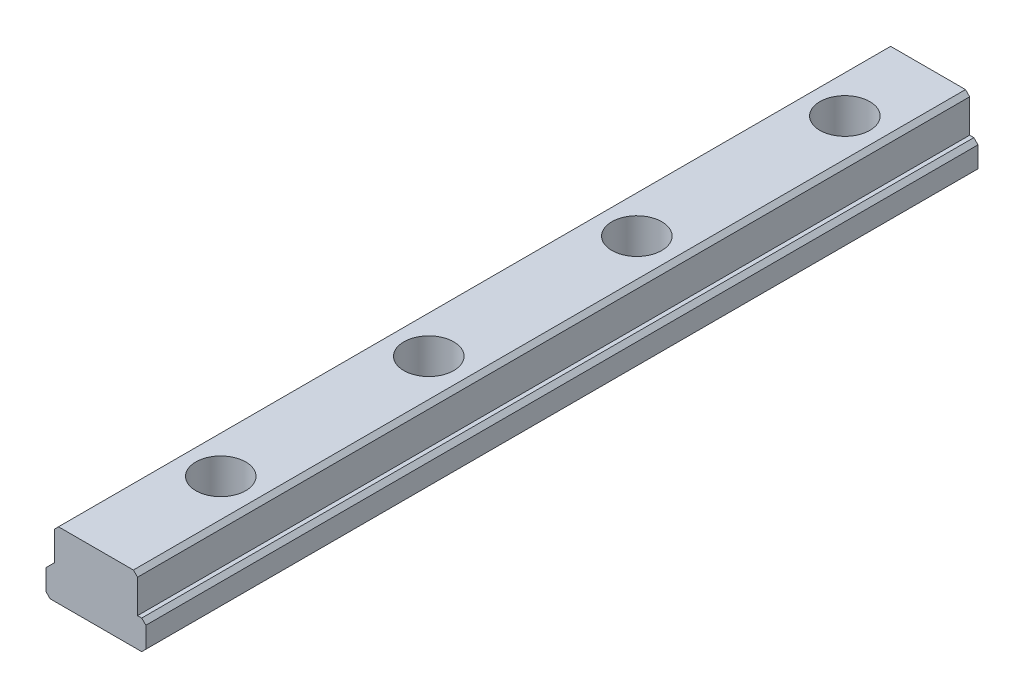
ISO-10303-21;
HEADER;
FILE_DESCRIPTION(('STEP AP214'),'2;1');
FILE_NAME('part.step','',(''),(''),'','','');
FILE_SCHEMA(('AUTOMOTIVE_DESIGN { 1 0 10303 214 1 1 1 1 }'));
ENDSEC;
DATA;
#1=APPLICATION_CONTEXT('core data for automotive mechanical design processes');
#2=APPLICATION_PROTOCOL_DEFINITION('international standard','automotive_design',2000,#1);
#3=PRODUCT_CONTEXT('',#1,'mechanical');
#4=PRODUCT('Part','Part','',(#3));
#5=PRODUCT_RELATED_PRODUCT_CATEGORY('part','',(#4));
#6=PRODUCT_DEFINITION_FORMATION('','',#4);
#7=PRODUCT_DEFINITION_CONTEXT('part definition',#1,'design');
#8=PRODUCT_DEFINITION('design','',#6,#7);
#9=PRODUCT_DEFINITION_SHAPE('','',#8);
#10=(LENGTH_UNIT() NAMED_UNIT(*) SI_UNIT(.MILLI.,.METRE.));
#11=(NAMED_UNIT(*) PLANE_ANGLE_UNIT() SI_UNIT($,.RADIAN.));
#12=(NAMED_UNIT(*) SI_UNIT($,.STERADIAN.) SOLID_ANGLE_UNIT());
#13=UNCERTAINTY_MEASURE_WITH_UNIT(LENGTH_MEASURE(1.E-05),#10,'distance_accuracy_value','');
#14=(GEOMETRIC_REPRESENTATION_CONTEXT(3) GLOBAL_UNCERTAINTY_ASSIGNED_CONTEXT((#13)) GLOBAL_UNIT_ASSIGNED_CONTEXT((#10,
#11,#12)) REPRESENTATION_CONTEXT('',''));
#15=CARTESIAN_POINT('',(0.,0.,0.));
#16=DIRECTION('',(0.,0.,1.));
#17=DIRECTION('',(1.,0.,0.));
#18=AXIS2_PLACEMENT_3D('',#15,#16,#17);
#19=CARTESIAN_POINT('',(8.4282917594694E-13,-396.,85.));
#20=DIRECTION('',(0.,1.,0.));
#21=DIRECTION('',(-1.,0.,0.));
#22=AXIS2_PLACEMENT_3D('',#19,#20,#21);
#23=CYLINDRICAL_SURFACE('',#22,1.75);
#24=CARTESIAN_POINT('',(7.86161542398364E-13,-4.,85.));
#25=DIRECTION('',(0.,1.,0.));
#26=DIRECTION('',(0.,0.,1.));
#27=AXIS2_PLACEMENT_3D('',#24,#25,#26);
#28=CIRCLE('',#27,1.75);
#29=CARTESIAN_POINT('',(7.86161542398364E-13,-4.,86.75));
#30=VERTEX_POINT('',#29);
#31=EDGE_CURVE('E258',#30,#30,#28,.T.);
#32=ORIENTED_EDGE('',*,*,#31,.F.);
#33=EDGE_LOOP('',(#32));
#34=FACE_BOUND('',#33,.T.);
#35=CARTESIAN_POINT('',(7.85655581384537E-13,-0.5,85.));
#36=DIRECTION('',(0.,1.,0.));
#37=DIRECTION('',(-1.,0.,0.));
#38=AXIS2_PLACEMENT_3D('',#35,#36,#37);
#39=CIRCLE('',#38,1.75);
#40=CARTESIAN_POINT('',(-1.74999999999921,-0.500000000000001,85.));
#41=VERTEX_POINT('',#40);
#42=EDGE_CURVE('E39',#41,#41,#39,.F.);
#43=ORIENTED_EDGE('',*,*,#42,.F.);
#44=EDGE_LOOP('',(#43));
#45=FACE_BOUND('',#44,.T.);
#46=ADVANCED_FACE('F35',(#34,#45),#23,.F.);
#47=CARTESIAN_POINT('',(5.80968075533705E-13,-396.,60.));
#48=DIRECTION('',(0.,1.,0.));
#49=DIRECTION('',(-1.,0.,0.));
#50=AXIS2_PLACEMENT_3D('',#47,#48,#49);
#51=CYLINDRICAL_SURFACE('',#50,1.75);
#52=CARTESIAN_POINT('',(5.24300441985129E-13,-4.,60.));
#53=DIRECTION('',(0.,1.,0.));
#54=DIRECTION('',(0.,0.,1.));
#55=AXIS2_PLACEMENT_3D('',#52,#53,#54);
#56=CIRCLE('',#55,1.75);
#57=CARTESIAN_POINT('',(5.24300441985129E-13,-4.,61.75));
#58=VERTEX_POINT('',#57);
#59=EDGE_CURVE('E255',#58,#58,#56,.T.);
#60=ORIENTED_EDGE('',*,*,#59,.F.);
#61=EDGE_LOOP('',(#60));
#62=FACE_BOUND('',#61,.T.);
#63=CARTESIAN_POINT('',(5.23794480971302E-13,-0.5,60.));
#64=DIRECTION('',(0.,1.,0.));
#65=DIRECTION('',(-1.,0.,0.));
#66=AXIS2_PLACEMENT_3D('',#63,#64,#65);
#67=CIRCLE('',#66,1.75);
#68=CARTESIAN_POINT('',(-1.74999999999948,-0.500000000000001,60.));
#69=VERTEX_POINT('',#68);
#70=EDGE_CURVE('E269',#69,#69,#67,.F.);
#71=ORIENTED_EDGE('',*,*,#70,.F.);
#72=EDGE_LOOP('',(#71));
#73=FACE_BOUND('',#72,.T.);
#74=ADVANCED_FACE('F355',(#62,#73),#51,.F.);
#75=CARTESIAN_POINT('',(3.1910697512047E-13,-396.,35.));
#76=DIRECTION('',(0.,1.,0.));
#77=DIRECTION('',(-1.,0.,0.));
#78=AXIS2_PLACEMENT_3D('',#75,#76,#77);
#79=CYLINDRICAL_SURFACE('',#78,1.75);
#80=CARTESIAN_POINT('',(2.62439341571894E-13,-4.,35.));
#81=DIRECTION('',(0.,1.,0.));
#82=DIRECTION('',(0.,0.,1.));
#83=AXIS2_PLACEMENT_3D('',#80,#81,#82);
#84=CIRCLE('',#83,1.75);
#85=CARTESIAN_POINT('',(2.62439341571894E-13,-4.,36.75));
#86=VERTEX_POINT('',#85);
#87=EDGE_CURVE('E252',#86,#86,#84,.T.);
#88=ORIENTED_EDGE('',*,*,#87,.F.);
#89=EDGE_LOOP('',(#88));
#90=FACE_BOUND('',#89,.T.);
#91=CARTESIAN_POINT('',(2.61933380558067E-13,-0.5,35.));
#92=DIRECTION('',(0.,1.,0.));
#93=DIRECTION('',(-1.,0.,0.));
#94=AXIS2_PLACEMENT_3D('',#91,#92,#93);
#95=CIRCLE('',#94,1.75);
#96=CARTESIAN_POINT('',(-1.74999999999974,-0.500000000000001,35.));
#97=VERTEX_POINT('',#96);
#98=EDGE_CURVE('E265',#97,#97,#95,.F.);
#99=ORIENTED_EDGE('',*,*,#98,.F.);
#100=EDGE_LOOP('',(#99));
#101=FACE_BOUND('',#100,.T.);
#102=ADVANCED_FACE('F361',(#90,#101),#79,.F.);
#103=CARTESIAN_POINT('',(0.,-396.,10.));
#104=DIRECTION('',(0.,1.,0.));
#105=DIRECTION('',(-1.,0.,0.));
#106=AXIS2_PLACEMENT_3D('',#103,#104,#105);
#107=CYLINDRICAL_SURFACE('',#106,1.75);
#108=CARTESIAN_POINT('',(0.,-4.,10.));
#109=DIRECTION('',(0.,1.,0.));
#110=DIRECTION('',(0.,0.,1.));
#111=AXIS2_PLACEMENT_3D('',#108,#109,#110);
#112=CIRCLE('',#111,1.75);
#113=CARTESIAN_POINT('',(0.,-4.,11.75));
#114=VERTEX_POINT('',#113);
#115=EDGE_CURVE('E249',#114,#114,#112,.T.);
#116=ORIENTED_EDGE('',*,*,#115,.F.);
#117=EDGE_LOOP('',(#116));
#118=FACE_BOUND('',#117,.T.);
#119=CARTESIAN_POINT('',(0.,-0.5,10.));
#120=DIRECTION('',(0.,1.,0.));
#121=DIRECTION('',(-1.,0.,0.));
#122=AXIS2_PLACEMENT_3D('',#119,#120,#121);
#123=CIRCLE('',#122,1.75);
#124=CARTESIAN_POINT('',(-1.75,-0.500000000000001,10.));
#125=VERTEX_POINT('',#124);
#126=EDGE_CURVE('E261',#125,#125,#123,.F.);
#127=ORIENTED_EDGE('',*,*,#126,.F.);
#128=EDGE_LOOP('',(#127));
#129=FACE_BOUND('',#128,.T.);
#130=ADVANCED_FACE('F299',(#118,#129),#107,.F.);
#131=CARTESIAN_POINT('',(6.,4.,100.));
#132=DIRECTION('',(0.,-1.,0.));
#133=DIRECTION('',(1.,0.,0.));
#134=AXIS2_PLACEMENT_3D('',#131,#132,#133);
#135=PLANE('',#134);
#136=CARTESIAN_POINT('',(7.85005060081046E-13,4.,85.));
#137=DIRECTION('',(0.,1.,0.));
#138=DIRECTION('',(-1.,0.,0.));
#139=AXIS2_PLACEMENT_3D('',#136,#137,#138);
#140=CIRCLE('',#139,3.);
#141=CARTESIAN_POINT('',(-2.99999999999921,4.,85.));
#142=VERTEX_POINT('',#141);
#143=EDGE_CURVE('E285',#142,#142,#140,.T.);
#144=ORIENTED_EDGE('',*,*,#143,.F.);
#145=EDGE_LOOP('',(#144));
#146=FACE_BOUND('',#145,.T.);
#147=CARTESIAN_POINT('',(5.23143959667811E-13,4.,60.));
#148=DIRECTION('',(0.,1.,0.));
#149=DIRECTION('',(-1.,0.,0.));
#150=AXIS2_PLACEMENT_3D('',#147,#148,#149);
#151=CIRCLE('',#150,3.);
#152=CARTESIAN_POINT('',(-2.99999999999948,4.,60.));
#153=VERTEX_POINT('',#152);
#154=EDGE_CURVE('E278',#153,#153,#151,.T.);
#155=ORIENTED_EDGE('',*,*,#154,.F.);
#156=EDGE_LOOP('',(#155));
#157=FACE_BOUND('',#156,.T.);
#158=CARTESIAN_POINT('',(2.61282859254576E-13,4.,35.));
#159=DIRECTION('',(0.,1.,0.));
#160=DIRECTION('',(-1.,0.,0.));
#161=AXIS2_PLACEMENT_3D('',#158,#159,#160);
#162=CIRCLE('',#161,3.);
#163=CARTESIAN_POINT('',(-2.99999999999974,4.,35.));
#164=VERTEX_POINT('',#163);
#165=EDGE_CURVE('E271',#164,#164,#162,.T.);
#166=ORIENTED_EDGE('',*,*,#165,.F.);
#167=EDGE_LOOP('',(#166));
#168=FACE_BOUND('',#167,.T.);
#169=CARTESIAN_POINT('',(0.,4.,10.));
#170=DIRECTION('',(0.,1.,0.));
#171=DIRECTION('',(-1.,0.,0.));
#172=AXIS2_PLACEMENT_3D('',#169,#170,#171);
#173=CIRCLE('',#172,3.);
#174=CARTESIAN_POINT('',(-3.,4.,10.));
#175=VERTEX_POINT('',#174);
#176=EDGE_CURVE('E267',#175,#175,#173,.T.);
#177=ORIENTED_EDGE('',*,*,#176,.F.);
#178=EDGE_LOOP('',(#177));
#179=FACE_BOUND('',#178,.T.);
#180=DIRECTION('',(-1.,0.,0.));
#181=VECTOR('',#180,1.);
#182=CARTESIAN_POINT('',(6.,4.,100.));
#183=LINE('',#182,#181);
#184=CARTESIAN_POINT('',(4.49999999999999,4.,100.));
#185=VERTEX_POINT('',#184);
#186=CARTESIAN_POINT('',(-4.5,4.,100.));
#187=VERTEX_POINT('',#186);
#188=EDGE_CURVE('E171',#185,#187,#183,.T.);
#189=ORIENTED_EDGE('',*,*,#188,.F.);
#190=DIRECTION('',(0.,0.,-1.));
#191=VECTOR('',#190,1.);
#192=CARTESIAN_POINT('',(4.49999999999999,4.,100.));
#193=LINE('',#192,#191);
#194=CARTESIAN_POINT('',(4.49999999999999,4.,0.));
#195=VERTEX_POINT('',#194);
#196=EDGE_CURVE('E59',#185,#195,#193,.T.);
#197=ORIENTED_EDGE('',*,*,#196,.T.);
#198=DIRECTION('',(-1.,0.,0.));
#199=VECTOR('',#198,1.);
#200=CARTESIAN_POINT('',(6.,4.,0.));
#201=LINE('',#200,#199);
#202=CARTESIAN_POINT('',(-4.5,4.,0.));
#203=VERTEX_POINT('',#202);
#204=EDGE_CURVE('E170',#195,#203,#201,.T.);
#205=ORIENTED_EDGE('',*,*,#204,.T.);
#206=DIRECTION('',(0.,0.,1.));
#207=VECTOR('',#206,1.);
#208=CARTESIAN_POINT('',(-4.5,4.,100.));
#209=LINE('',#208,#207);
#210=EDGE_CURVE('E238',#203,#187,#209,.T.);
#211=ORIENTED_EDGE('',*,*,#210,.T.);
#212=EDGE_LOOP('',(#189,#197,#205,#211));
#213=FACE_BOUND('',#212,.T.);
#214=ADVANCED_FACE('F296',(#146,#157,#168,#179,#213),#135,.F.);
#215=CARTESIAN_POINT('',(-6.,4.,100.));
#216=DIRECTION('',(1.,0.,0.));
#217=DIRECTION('',(0.,1.,0.));
#218=AXIS2_PLACEMENT_3D('',#215,#216,#217);
#219=PLANE('',#218);
#220=DIRECTION('',(0.,-1.,0.));
#221=VECTOR('',#220,1.);
#222=CARTESIAN_POINT('',(-6.,4.,100.));
#223=LINE('',#222,#221);
#224=CARTESIAN_POINT('',(-6.,-1.,100.));
#225=VERTEX_POINT('',#224);
#226=CARTESIAN_POINT('',(-6.,-3.49999999999999,100.));
#227=VERTEX_POINT('',#226);
#228=EDGE_CURVE('E174',#225,#227,#223,.T.);
#229=ORIENTED_EDGE('',*,*,#228,.F.);
#230=DIRECTION('',(0.,0.,-1.));
#231=VECTOR('',#230,1.);
#232=CARTESIAN_POINT('',(-6.,-1.,100.));
#233=LINE('',#232,#231);
#234=CARTESIAN_POINT('',(-6.,-1.,0.));
#235=VERTEX_POINT('',#234);
#236=EDGE_CURVE('E210',#225,#235,#233,.T.);
#237=ORIENTED_EDGE('',*,*,#236,.T.);
#238=DIRECTION('',(0.,-1.,0.));
#239=VECTOR('',#238,1.);
#240=CARTESIAN_POINT('',(-6.,4.,0.));
#241=LINE('',#240,#239);
#242=CARTESIAN_POINT('',(-6.,-3.49999999999999,0.));
#243=VERTEX_POINT('',#242);
#244=EDGE_CURVE('E185',#235,#243,#241,.T.);
#245=ORIENTED_EDGE('',*,*,#244,.T.);
#246=DIRECTION('',(0.,0.,1.));
#247=VECTOR('',#246,1.);
#248=CARTESIAN_POINT('',(-6.,-3.49999999999999,100.));
#249=LINE('',#248,#247);
#250=EDGE_CURVE('E208',#243,#227,#249,.T.);
#251=ORIENTED_EDGE('',*,*,#250,.T.);
#252=EDGE_LOOP('',(#229,#237,#245,#251));
#253=FACE_BOUND('',#252,.T.);
#254=ADVANCED_FACE('F298',(#253),#219,.F.);
#255=CARTESIAN_POINT('',(-6.,-4.,100.));
#256=DIRECTION('',(0.,1.,0.));
#257=DIRECTION('',(0.,0.,1.));
#258=AXIS2_PLACEMENT_3D('',#255,#256,#257);
#259=PLANE('',#258);
#260=ORIENTED_EDGE('',*,*,#31,.T.);
#261=EDGE_LOOP('',(#260));
#262=FACE_BOUND('',#261,.T.);
#263=ORIENTED_EDGE('',*,*,#59,.T.);
#264=EDGE_LOOP('',(#263));
#265=FACE_BOUND('',#264,.T.);
#266=ORIENTED_EDGE('',*,*,#87,.T.);
#267=EDGE_LOOP('',(#266));
#268=FACE_BOUND('',#267,.T.);
#269=ORIENTED_EDGE('',*,*,#115,.T.);
#270=EDGE_LOOP('',(#269));
#271=FACE_BOUND('',#270,.T.);
#272=DIRECTION('',(1.,0.,0.));
#273=VECTOR('',#272,1.);
#274=CARTESIAN_POINT('',(-6.,-4.,100.));
#275=LINE('',#274,#273);
#276=CARTESIAN_POINT('',(-5.49999999999999,-4.,100.));
#277=VERTEX_POINT('',#276);
#278=CARTESIAN_POINT('',(5.5,-4.,100.));
#279=VERTEX_POINT('',#278);
#280=EDGE_CURVE('E178',#277,#279,#275,.T.);
#281=ORIENTED_EDGE('',*,*,#280,.F.);
#282=DIRECTION('',(0.,0.,-1.));
#283=VECTOR('',#282,1.);
#284=CARTESIAN_POINT('',(-5.49999999999999,-4.,100.));
#285=LINE('',#284,#283);
#286=CARTESIAN_POINT('',(-5.49999999999999,-4.,0.));
#287=VERTEX_POINT('',#286);
#288=EDGE_CURVE('E226',#277,#287,#285,.T.);
#289=ORIENTED_EDGE('',*,*,#288,.T.);
#290=DIRECTION('',(1.,0.,0.));
#291=VECTOR('',#290,1.);
#292=CARTESIAN_POINT('',(-6.,-4.,0.));
#293=LINE('',#292,#291);
#294=CARTESIAN_POINT('',(5.5,-4.,0.));
#295=VERTEX_POINT('',#294);
#296=EDGE_CURVE('E188',#287,#295,#293,.T.);
#297=ORIENTED_EDGE('',*,*,#296,.T.);
#298=DIRECTION('',(0.,0.,1.));
#299=VECTOR('',#298,1.);
#300=CARTESIAN_POINT('',(5.5,-4.,100.));
#301=LINE('',#300,#299);
#302=EDGE_CURVE('E224',#295,#279,#301,.T.);
#303=ORIENTED_EDGE('',*,*,#302,.T.);
#304=EDGE_LOOP('',(#281,#289,#297,#303));
#305=FACE_BOUND('',#304,.T.);
#306=ADVANCED_FACE('F334',(#262,#265,#268,#271,#305),#259,.F.);
#307=CARTESIAN_POINT('',(6.,-4.,100.));
#308=DIRECTION('',(-1.,0.,0.));
#309=DIRECTION('',(0.,-1.,0.));
#310=AXIS2_PLACEMENT_3D('',#307,#308,#309);
#311=PLANE('',#310);
#312=DIRECTION('',(0.,1.,0.));
#313=VECTOR('',#312,1.);
#314=CARTESIAN_POINT('',(6.,-4.,100.));
#315=LINE('',#314,#313);
#316=CARTESIAN_POINT('',(6.,-3.5,100.));
#317=VERTEX_POINT('',#316);
#318=CARTESIAN_POINT('',(6.,-1.00000000000002,100.));
#319=VERTEX_POINT('',#318);
#320=EDGE_CURVE('E181',#317,#319,#315,.T.);
#321=ORIENTED_EDGE('',*,*,#320,.F.);
#322=DIRECTION('',(0.,0.,-1.));
#323=VECTOR('',#322,1.);
#324=CARTESIAN_POINT('',(6.,-3.5,100.));
#325=LINE('',#324,#323);
#326=CARTESIAN_POINT('',(6.,-3.5,0.));
#327=VERTEX_POINT('',#326);
#328=EDGE_CURVE('E232',#317,#327,#325,.T.);
#329=ORIENTED_EDGE('',*,*,#328,.T.);
#330=DIRECTION('',(0.,1.,0.));
#331=VECTOR('',#330,1.);
#332=CARTESIAN_POINT('',(6.,-4.,0.));
#333=LINE('',#332,#331);
#334=CARTESIAN_POINT('',(6.,-1.00000000000002,0.));
#335=VERTEX_POINT('',#334);
#336=EDGE_CURVE('E175',#327,#335,#333,.T.);
#337=ORIENTED_EDGE('',*,*,#336,.T.);
#338=DIRECTION('',(0.,0.,1.));
#339=VECTOR('',#338,1.);
#340=CARTESIAN_POINT('',(6.,-1.00000000000002,100.));
#341=LINE('',#340,#339);
#342=EDGE_CURVE('E229',#335,#319,#341,.T.);
#343=ORIENTED_EDGE('',*,*,#342,.T.);
#344=EDGE_LOOP('',(#321,#329,#337,#343));
#345=FACE_BOUND('',#344,.T.);
#346=ADVANCED_FACE('F341',(#345),#311,.F.);
#347=CARTESIAN_POINT('',(0.,0.,100.));
#348=DIRECTION('',(0.,0.,1.));
#349=DIRECTION('',(1.,0.,0.));
#350=AXIS2_PLACEMENT_3D('',#347,#348,#349);
#351=PLANE('',#350);
#352=DIRECTION('',(0.,1.,0.));
#353=VECTOR('',#352,1.);
#354=CARTESIAN_POINT('',(-5.,-0.500000000000001,100.));
#355=LINE('',#354,#353);
#356=CARTESIAN_POINT('',(-5.,0.,100.));
#357=VERTEX_POINT('',#356);
#358=CARTESIAN_POINT('',(-5.,3.5,100.));
#359=VERTEX_POINT('',#358);
#360=EDGE_CURVE('E159',#357,#359,#355,.T.);
#361=ORIENTED_EDGE('',*,*,#360,.F.);
#362=DIRECTION('',(0.707106781186538,0.707106781186557,0.));
#363=VECTOR('',#362,1.);
#364=CARTESIAN_POINT('',(-5.,0.,100.));
#365=LINE('',#364,#363);
#366=CARTESIAN_POINT('',(-5.5,-0.500000000000001,100.));
#367=VERTEX_POINT('',#366);
#368=EDGE_CURVE('E44',#357,#367,#365,.F.);
#369=ORIENTED_EDGE('',*,*,#368,.T.);
#370=DIRECTION('',(0.707106781186548,0.707106781186548,0.));
#371=VECTOR('',#370,1.);
#372=CARTESIAN_POINT('',(-2.5,2.5,100.));
#373=LINE('',#372,#371);
#374=EDGE_CURVE('E206',#367,#225,#373,.F.);
#375=ORIENTED_EDGE('',*,*,#374,.T.);
#376=ORIENTED_EDGE('',*,*,#228,.T.);
#377=DIRECTION('',(-0.707106781186548,0.707106781186548,0.));
#378=VECTOR('',#377,1.);
#379=CARTESIAN_POINT('',(-4.74999999999999,-4.74999999999999,100.));
#380=LINE('',#379,#378);
#381=EDGE_CURVE('E204',#227,#277,#380,.F.);
#382=ORIENTED_EDGE('',*,*,#381,.T.);
#383=ORIENTED_EDGE('',*,*,#280,.T.);
#384=DIRECTION('',(-0.707106781186548,-0.707106781186548,0.));
#385=VECTOR('',#384,1.);
#386=CARTESIAN_POINT('',(4.75,-4.75,100.));
#387=LINE('',#386,#385);
#388=EDGE_CURVE('E202',#279,#317,#387,.F.);
#389=ORIENTED_EDGE('',*,*,#388,.T.);
#390=ORIENTED_EDGE('',*,*,#320,.T.);
#391=DIRECTION('',(0.707106781186538,-0.707106781186557,0.));
#392=VECTOR('',#391,1.);
#393=CARTESIAN_POINT('',(2.50000000000007,2.50000000000001,100.));
#394=LINE('',#393,#392);
#395=CARTESIAN_POINT('',(5.5,-0.500000000000003,100.));
#396=VERTEX_POINT('',#395);
#397=EDGE_CURVE('E164',#319,#396,#394,.F.);
#398=ORIENTED_EDGE('',*,*,#397,.T.);
#399=DIRECTION('',(1.,0.,0.));
#400=VECTOR('',#399,1.);
#401=CARTESIAN_POINT('',(6.,-0.500000000000003,100.));
#402=LINE('',#401,#400);
#403=CARTESIAN_POINT('',(5.,-0.500000000000003,100.));
#404=VERTEX_POINT('',#403);
#405=EDGE_CURVE('E150',#404,#396,#402,.T.);
#406=ORIENTED_EDGE('',*,*,#405,.F.);
#407=DIRECTION('',(0.,-1.,0.));
#408=VECTOR('',#407,1.);
#409=CARTESIAN_POINT('',(5.,-0.500000000000003,100.));
#410=LINE('',#409,#408);
#411=CARTESIAN_POINT('',(5.,3.49999999999997,100.));
#412=VERTEX_POINT('',#411);
#413=EDGE_CURVE('E140',#412,#404,#410,.T.);
#414=ORIENTED_EDGE('',*,*,#413,.F.);
#415=DIRECTION('',(0.707106781186537,-0.707106781186558,0.));
#416=VECTOR('',#415,1.);
#417=CARTESIAN_POINT('',(4.25000000000006,4.24999999999993,100.));
#418=LINE('',#417,#416);
#419=EDGE_CURVE('E199',#412,#185,#418,.F.);
#420=ORIENTED_EDGE('',*,*,#419,.T.);
#421=ORIENTED_EDGE('',*,*,#188,.T.);
#422=DIRECTION('',(0.707106781186548,0.707106781186547,0.));
#423=VECTOR('',#422,1.);
#424=CARTESIAN_POINT('',(-4.24999999999999,4.25,100.));
#425=LINE('',#424,#423);
#426=EDGE_CURVE('E197',#187,#359,#425,.F.);
#427=ORIENTED_EDGE('',*,*,#426,.T.);
#428=EDGE_LOOP('',(#361,#369,#375,#376,#382,#383,#389,#390,#398,#406,#414,#420,#421,#427));
#429=FACE_BOUND('',#428,.T.);
#430=ADVANCED_FACE('F162',(#429),#351,.T.);
#431=CARTESIAN_POINT('',(0.,0.,0.));
#432=DIRECTION('',(0.,0.,1.));
#433=DIRECTION('',(1.,0.,0.));
#434=AXIS2_PLACEMENT_3D('',#431,#432,#433);
#435=PLANE('',#434);
#436=ORIENTED_EDGE('',*,*,#244,.F.);
#437=DIRECTION('',(-0.707106781186548,-0.707106781186548,0.));
#438=VECTOR('',#437,1.);
#439=CARTESIAN_POINT('',(-5.5,-0.500000000000001,0.));
#440=LINE('',#439,#438);
#441=CARTESIAN_POINT('',(-5.5,-0.500000000000001,0.));
#442=VERTEX_POINT('',#441);
#443=EDGE_CURVE('E222',#235,#442,#440,.F.);
#444=ORIENTED_EDGE('',*,*,#443,.T.);
#445=DIRECTION('',(-0.707106781186538,-0.707106781186557,0.));
#446=VECTOR('',#445,1.);
#447=CARTESIAN_POINT('',(-2.50000000000007,2.5,0.));
#448=LINE('',#447,#446);
#449=CARTESIAN_POINT('',(-5.,0.,0.));
#450=VERTEX_POINT('',#449);
#451=EDGE_CURVE('E11',#442,#450,#448,.F.);
#452=ORIENTED_EDGE('',*,*,#451,.T.);
#453=DIRECTION('',(0.,1.,0.));
#454=VECTOR('',#453,1.);
#455=CARTESIAN_POINT('',(-5.,0.,0.));
#456=LINE('',#455,#454);
#457=CARTESIAN_POINT('',(-5.,3.5,0.));
#458=VERTEX_POINT('',#457);
#459=EDGE_CURVE('E183',#450,#458,#456,.T.);
#460=ORIENTED_EDGE('',*,*,#459,.T.);
#461=DIRECTION('',(-0.707106781186548,-0.707106781186547,0.));
#462=VECTOR('',#461,1.);
#463=CARTESIAN_POINT('',(-4.5,4.,0.));
#464=LINE('',#463,#462);
#465=EDGE_CURVE('E52',#458,#203,#464,.F.);
#466=ORIENTED_EDGE('',*,*,#465,.T.);
#467=ORIENTED_EDGE('',*,*,#204,.F.);
#468=DIRECTION('',(-0.707106781186537,0.707106781186558,0.));
#469=VECTOR('',#468,1.);
#470=CARTESIAN_POINT('',(5.,3.49999999999997,0.));
#471=LINE('',#470,#469);
#472=CARTESIAN_POINT('',(5.,3.49999999999997,0.));
#473=VERTEX_POINT('',#472);
#474=EDGE_CURVE('E214',#195,#473,#471,.F.);
#475=ORIENTED_EDGE('',*,*,#474,.T.);
#476=DIRECTION('',(0.,-1.,0.));
#477=VECTOR('',#476,1.);
#478=CARTESIAN_POINT('',(5.,0.,0.));
#479=LINE('',#478,#477);
#480=CARTESIAN_POINT('',(5.,-0.500000000000003,0.));
#481=VERTEX_POINT('',#480);
#482=EDGE_CURVE('E194',#473,#481,#479,.T.);
#483=ORIENTED_EDGE('',*,*,#482,.T.);
#484=DIRECTION('',(1.,0.,0.));
#485=VECTOR('',#484,1.);
#486=CARTESIAN_POINT('',(0.,-0.500000000000003,0.));
#487=LINE('',#486,#485);
#488=CARTESIAN_POINT('',(5.5,-0.500000000000003,0.));
#489=VERTEX_POINT('',#488);
#490=EDGE_CURVE('E158',#481,#489,#487,.T.);
#491=ORIENTED_EDGE('',*,*,#490,.T.);
#492=DIRECTION('',(-0.707106781186538,0.707106781186557,0.));
#493=VECTOR('',#492,1.);
#494=CARTESIAN_POINT('',(6.,-1.00000000000002,0.));
#495=LINE('',#494,#493);
#496=EDGE_CURVE('E216',#489,#335,#495,.F.);
#497=ORIENTED_EDGE('',*,*,#496,.T.);
#498=ORIENTED_EDGE('',*,*,#336,.F.);
#499=DIRECTION('',(0.707106781186548,0.707106781186548,0.));
#500=VECTOR('',#499,1.);
#501=CARTESIAN_POINT('',(6.,-3.5,0.));
#502=LINE('',#501,#500);
#503=EDGE_CURVE('E218',#327,#295,#502,.F.);
#504=ORIENTED_EDGE('',*,*,#503,.T.);
#505=ORIENTED_EDGE('',*,*,#296,.F.);
#506=DIRECTION('',(0.707106781186548,-0.707106781186548,0.));
#507=VECTOR('',#506,1.);
#508=CARTESIAN_POINT('',(-5.49999999999999,-4.,0.));
#509=LINE('',#508,#507);
#510=EDGE_CURVE('E220',#287,#243,#509,.F.);
#511=ORIENTED_EDGE('',*,*,#510,.T.);
#512=EDGE_LOOP('',(#436,#444,#452,#460,#466,#467,#475,#483,#491,#497,#498,#504,#505,#511));
#513=FACE_BOUND('',#512,.T.);
#514=ADVANCED_FACE('F307',(#513),#435,.F.);
#515=CARTESIAN_POINT('',(-5.,-0.500000000000001,-300.));
#516=DIRECTION('',(1.,0.,0.));
#517=DIRECTION('',(0.,0.,-1.));
#518=AXIS2_PLACEMENT_3D('',#515,#516,#517);
#519=PLANE('',#518);
#520=ORIENTED_EDGE('',*,*,#459,.F.);
#521=DIRECTION('',(0.,0.,1.));
#522=VECTOR('',#521,1.);
#523=CARTESIAN_POINT('',(-5.,0.,100.));
#524=LINE('',#523,#522);
#525=EDGE_CURVE('E244',#450,#357,#524,.T.);
#526=ORIENTED_EDGE('',*,*,#525,.T.);
#527=ORIENTED_EDGE('',*,*,#360,.T.);
#528=DIRECTION('',(0.,0.,-1.));
#529=VECTOR('',#528,1.);
#530=CARTESIAN_POINT('',(-5.,3.5,-300.));
#531=LINE('',#530,#529);
#532=EDGE_CURVE('E242',#359,#458,#531,.T.);
#533=ORIENTED_EDGE('',*,*,#532,.T.);
#534=EDGE_LOOP('',(#520,#526,#527,#533));
#535=FACE_BOUND('',#534,.T.);
#536=ADVANCED_FACE('F313',(#535),#519,.F.);
#537=CARTESIAN_POINT('',(6.,-0.500000000000003,-300.));
#538=DIRECTION('',(0.,-1.,0.));
#539=DIRECTION('',(0.,0.,-1.));
#540=AXIS2_PLACEMENT_3D('',#537,#538,#539);
#541=PLANE('',#540);
#542=ORIENTED_EDGE('',*,*,#405,.T.);
#543=DIRECTION('',(0.,0.,-1.));
#544=VECTOR('',#543,1.);
#545=CARTESIAN_POINT('',(5.5,-0.500000000000003,-300.));
#546=LINE('',#545,#544);
#547=EDGE_CURVE('E235',#396,#489,#546,.T.);
#548=ORIENTED_EDGE('',*,*,#547,.T.);
#549=ORIENTED_EDGE('',*,*,#490,.F.);
#550=DIRECTION('',(0.,0.,1.));
#551=VECTOR('',#550,1.);
#552=CARTESIAN_POINT('',(5.,-0.500000000000003,-300.));
#553=LINE('',#552,#551);
#554=EDGE_CURVE('E144',#481,#404,#553,.T.);
#555=ORIENTED_EDGE('',*,*,#554,.T.);
#556=EDGE_LOOP('',(#542,#548,#549,#555));
#557=FACE_BOUND('',#556,.T.);
#558=ADVANCED_FACE('F155',(#557),#541,.F.);
#559=CARTESIAN_POINT('',(5.,-0.500000000000003,-300.));
#560=DIRECTION('',(-1.,0.,0.));
#561=DIRECTION('',(0.,-1.,0.));
#562=AXIS2_PLACEMENT_3D('',#559,#560,#561);
#563=PLANE('',#562);
#564=ORIENTED_EDGE('',*,*,#482,.F.);
#565=DIRECTION('',(0.,0.,1.));
#566=VECTOR('',#565,1.);
#567=CARTESIAN_POINT('',(5.,3.49999999999997,-300.));
#568=LINE('',#567,#566);
#569=EDGE_CURVE('E147',#473,#412,#568,.T.);
#570=ORIENTED_EDGE('',*,*,#569,.T.);
#571=ORIENTED_EDGE('',*,*,#413,.T.);
#572=ORIENTED_EDGE('',*,*,#554,.F.);
#573=EDGE_LOOP('',(#564,#570,#571,#572));
#574=FACE_BOUND('',#573,.T.);
#575=ADVANCED_FACE('F143',(#574),#563,.F.);
#576=CARTESIAN_POINT('',(-5.,0.,-300.));
#577=DIRECTION('',(-0.707106781186557,0.707106781186538,0.));
#578=DIRECTION('',(0.,0.,-1.));
#579=AXIS2_PLACEMENT_3D('',#576,#577,#578);
#580=PLANE('',#579);
#581=ORIENTED_EDGE('',*,*,#525,.F.);
#582=ORIENTED_EDGE('',*,*,#451,.F.);
#583=DIRECTION('',(0.,0.,-1.));
#584=VECTOR('',#583,1.);
#585=CARTESIAN_POINT('',(-5.49999999999999,-0.500000000000001,0.));
#586=LINE('',#585,#584);
#587=EDGE_CURVE('E151',#367,#442,#586,.T.);
#588=ORIENTED_EDGE('',*,*,#587,.F.);
#589=ORIENTED_EDGE('',*,*,#368,.F.);
#590=EDGE_LOOP('',(#581,#582,#588,#589));
#591=FACE_BOUND('',#590,.T.);
#592=ADVANCED_FACE('F317',(#591),#580,.T.);
#593=CARTESIAN_POINT('',(-5.5,-0.500000000000001,-300.));
#594=DIRECTION('',(0.707106781186547,-0.707106781186547,0.));
#595=DIRECTION('',(0.,0.,1.));
#596=AXIS2_PLACEMENT_3D('',#593,#594,#595);
#597=PLANE('',#596);
#598=ORIENTED_EDGE('',*,*,#443,.F.);
#599=ORIENTED_EDGE('',*,*,#236,.F.);
#600=ORIENTED_EDGE('',*,*,#374,.F.);
#601=ORIENTED_EDGE('',*,*,#587,.T.);
#602=EDGE_LOOP('',(#598,#599,#600,#601));
#603=FACE_BOUND('',#602,.T.);
#604=ADVANCED_FACE('F326',(#603),#597,.F.);
#605=CARTESIAN_POINT('',(-5.49999999999999,-4.,100.));
#606=DIRECTION('',(0.707106781186548,0.707106781186548,0.));
#607=DIRECTION('',(0.,0.,-1.));
#608=AXIS2_PLACEMENT_3D('',#605,#606,#607);
#609=PLANE('',#608);
#610=ORIENTED_EDGE('',*,*,#381,.F.);
#611=ORIENTED_EDGE('',*,*,#250,.F.);
#612=ORIENTED_EDGE('',*,*,#510,.F.);
#613=ORIENTED_EDGE('',*,*,#288,.F.);
#614=EDGE_LOOP('',(#610,#611,#612,#613));
#615=FACE_BOUND('',#614,.T.);
#616=ADVANCED_FACE('F329',(#615),#609,.F.);
#617=CARTESIAN_POINT('',(6.,-3.5,100.));
#618=DIRECTION('',(-0.707106781186547,0.707106781186547,0.));
#619=DIRECTION('',(0.,0.,-1.));
#620=AXIS2_PLACEMENT_3D('',#617,#618,#619);
#621=PLANE('',#620);
#622=ORIENTED_EDGE('',*,*,#388,.F.);
#623=ORIENTED_EDGE('',*,*,#302,.F.);
#624=ORIENTED_EDGE('',*,*,#503,.F.);
#625=ORIENTED_EDGE('',*,*,#328,.F.);
#626=EDGE_LOOP('',(#622,#623,#624,#625));
#627=FACE_BOUND('',#626,.T.);
#628=ADVANCED_FACE('F337',(#627),#621,.F.);
#629=CARTESIAN_POINT('',(6.,-1.00000000000002,100.));
#630=DIRECTION('',(-0.707106781186557,-0.707106781186538,0.));
#631=DIRECTION('',(0.,0.,1.));
#632=AXIS2_PLACEMENT_3D('',#629,#630,#631);
#633=PLANE('',#632);
#634=ORIENTED_EDGE('',*,*,#496,.F.);
#635=ORIENTED_EDGE('',*,*,#547,.F.);
#636=ORIENTED_EDGE('',*,*,#397,.F.);
#637=ORIENTED_EDGE('',*,*,#342,.F.);
#638=EDGE_LOOP('',(#634,#635,#636,#637));
#639=FACE_BOUND('',#638,.T.);
#640=ADVANCED_FACE('F346',(#639),#633,.F.);
#641=CARTESIAN_POINT('',(5.,3.49999999999997,-300.));
#642=DIRECTION('',(-0.707106781186558,-0.707106781186537,0.));
#643=DIRECTION('',(0.,0.,1.));
#644=AXIS2_PLACEMENT_3D('',#641,#642,#643);
#645=PLANE('',#644);
#646=ORIENTED_EDGE('',*,*,#474,.F.);
#647=ORIENTED_EDGE('',*,*,#196,.F.);
#648=ORIENTED_EDGE('',*,*,#419,.F.);
#649=ORIENTED_EDGE('',*,*,#569,.F.);
#650=EDGE_LOOP('',(#646,#647,#648,#649));
#651=FACE_BOUND('',#650,.T.);
#652=ADVANCED_FACE('F305',(#651),#645,.F.);
#653=CARTESIAN_POINT('',(-4.5,4.,100.));
#654=DIRECTION('',(0.707106781186547,-0.707106781186548,0.));
#655=DIRECTION('',(0.,0.,1.));
#656=AXIS2_PLACEMENT_3D('',#653,#654,#655);
#657=PLANE('',#656);
#658=ORIENTED_EDGE('',*,*,#465,.F.);
#659=ORIENTED_EDGE('',*,*,#532,.F.);
#660=ORIENTED_EDGE('',*,*,#426,.F.);
#661=ORIENTED_EDGE('',*,*,#210,.F.);
#662=EDGE_LOOP('',(#658,#659,#660,#661));
#663=FACE_BOUND('',#662,.T.);
#664=ADVANCED_FACE('F37',(#663),#657,.F.);
#665=CARTESIAN_POINT('',(0.,-0.5,10.));
#666=DIRECTION('',(0.,1.,0.));
#667=DIRECTION('',(-1.,0.,0.));
#668=AXIS2_PLACEMENT_3D('',#665,#666,#667);
#669=PLANE('',#668);
#670=CARTESIAN_POINT('',(0.,-0.5,10.));
#671=DIRECTION('',(0.,1.,0.));
#672=DIRECTION('',(-1.,0.,0.));
#673=AXIS2_PLACEMENT_3D('',#670,#671,#672);
#674=CIRCLE('',#673,3.);
#675=CARTESIAN_POINT('',(-3.,-0.500000000000001,10.));
#676=VERTEX_POINT('',#675);
#677=EDGE_CURVE('E264',#676,#676,#674,.T.);
#678=ORIENTED_EDGE('',*,*,#677,.T.);
#679=EDGE_LOOP('',(#678));
#680=FACE_BOUND('',#679,.T.);
#681=ORIENTED_EDGE('',*,*,#126,.T.);
#682=EDGE_LOOP('',(#681));
#683=FACE_BOUND('',#682,.T.);
#684=ADVANCED_FACE('F424',(#680,#683),#669,.T.);
#685=CARTESIAN_POINT('',(0.,-0.5,10.));
#686=DIRECTION('',(0.,1.,0.));
#687=DIRECTION('',(-1.,0.,0.));
#688=AXIS2_PLACEMENT_3D('',#685,#686,#687);
#689=CYLINDRICAL_SURFACE('',#688,3.);
#690=ORIENTED_EDGE('',*,*,#677,.F.);
#691=EDGE_LOOP('',(#690));
#692=FACE_BOUND('',#691,.T.);
#693=ORIENTED_EDGE('',*,*,#176,.T.);
#694=EDGE_LOOP('',(#693));
#695=FACE_BOUND('',#694,.T.);
#696=ADVANCED_FACE('F294',(#692,#695),#689,.F.);
#697=CARTESIAN_POINT('',(2.61933380558067E-13,-0.5,35.));
#698=DIRECTION('',(0.,1.,0.));
#699=DIRECTION('',(-1.,0.,0.));
#700=AXIS2_PLACEMENT_3D('',#697,#698,#699);
#701=PLANE('',#700);
#702=CARTESIAN_POINT('',(2.61933380558067E-13,-0.5,35.));
#703=DIRECTION('',(0.,1.,0.));
#704=DIRECTION('',(-1.,0.,0.));
#705=AXIS2_PLACEMENT_3D('',#702,#703,#704);
#706=CIRCLE('',#705,3.);
#707=CARTESIAN_POINT('',(-2.99999999999974,-0.500000000000001,35.));
#708=VERTEX_POINT('',#707);
#709=EDGE_CURVE('E268',#708,#708,#706,.T.);
#710=ORIENTED_EDGE('',*,*,#709,.T.);
#711=EDGE_LOOP('',(#710));
#712=FACE_BOUND('',#711,.T.);
#713=ORIENTED_EDGE('',*,*,#98,.T.);
#714=EDGE_LOOP('',(#713));
#715=FACE_BOUND('',#714,.T.);
#716=ADVANCED_FACE('F476',(#712,#715),#701,.T.);
#717=CARTESIAN_POINT('',(2.61933380558067E-13,-0.5,35.));
#718=DIRECTION('',(0.,1.,0.));
#719=DIRECTION('',(-1.,0.,0.));
#720=AXIS2_PLACEMENT_3D('',#717,#718,#719);
#721=CYLINDRICAL_SURFACE('',#720,3.);
#722=ORIENTED_EDGE('',*,*,#709,.F.);
#723=EDGE_LOOP('',(#722));
#724=FACE_BOUND('',#723,.T.);
#725=ORIENTED_EDGE('',*,*,#165,.T.);
#726=EDGE_LOOP('',(#725));
#727=FACE_BOUND('',#726,.T.);
#728=ADVANCED_FACE('F485',(#724,#727),#721,.F.);
#729=CARTESIAN_POINT('',(5.23794480971302E-13,-0.5,60.));
#730=DIRECTION('',(0.,1.,0.));
#731=DIRECTION('',(-1.,0.,0.));
#732=AXIS2_PLACEMENT_3D('',#729,#730,#731);
#733=PLANE('',#732);
#734=CARTESIAN_POINT('',(5.23794480971302E-13,-0.5,60.));
#735=DIRECTION('',(0.,1.,0.));
#736=DIRECTION('',(-1.,0.,0.));
#737=AXIS2_PLACEMENT_3D('',#734,#735,#736);
#738=CIRCLE('',#737,3.);
#739=CARTESIAN_POINT('',(-2.99999999999948,-0.500000000000001,60.));
#740=VERTEX_POINT('',#739);
#741=EDGE_CURVE('E272',#740,#740,#738,.T.);
#742=ORIENTED_EDGE('',*,*,#741,.T.);
#743=EDGE_LOOP('',(#742));
#744=FACE_BOUND('',#743,.T.);
#745=ORIENTED_EDGE('',*,*,#70,.T.);
#746=EDGE_LOOP('',(#745));
#747=FACE_BOUND('',#746,.T.);
#748=ADVANCED_FACE('F495',(#744,#747),#733,.T.);
#749=CARTESIAN_POINT('',(5.23794480971302E-13,-0.5,60.));
#750=DIRECTION('',(0.,1.,0.));
#751=DIRECTION('',(-1.,0.,0.));
#752=AXIS2_PLACEMENT_3D('',#749,#750,#751);
#753=CYLINDRICAL_SURFACE('',#752,3.);
#754=ORIENTED_EDGE('',*,*,#741,.F.);
#755=EDGE_LOOP('',(#754));
#756=FACE_BOUND('',#755,.T.);
#757=ORIENTED_EDGE('',*,*,#154,.T.);
#758=EDGE_LOOP('',(#757));
#759=FACE_BOUND('',#758,.T.);
#760=ADVANCED_FACE('F505',(#756,#759),#753,.F.);
#761=CARTESIAN_POINT('',(7.85655581384537E-13,-0.5,85.));
#762=DIRECTION('',(0.,1.,0.));
#763=DIRECTION('',(-1.,0.,0.));
#764=AXIS2_PLACEMENT_3D('',#761,#762,#763);
#765=PLANE('',#764);
#766=CARTESIAN_POINT('',(7.85655581384537E-13,-0.5,85.));
#767=DIRECTION('',(0.,1.,0.));
#768=DIRECTION('',(-1.,0.,0.));
#769=AXIS2_PLACEMENT_3D('',#766,#767,#768);
#770=CIRCLE('',#769,3.);
#771=CARTESIAN_POINT('',(-2.99999999999921,-0.500000000000001,85.));
#772=VERTEX_POINT('',#771);
#773=EDGE_CURVE('E541',#772,#772,#770,.T.);
#774=ORIENTED_EDGE('',*,*,#773,.T.);
#775=EDGE_LOOP('',(#774));
#776=FACE_BOUND('',#775,.T.);
#777=ORIENTED_EDGE('',*,*,#42,.T.);
#778=EDGE_LOOP('',(#777));
#779=FACE_BOUND('',#778,.T.);
#780=ADVANCED_FACE('F514',(#776,#779),#765,.T.);
#781=CARTESIAN_POINT('',(7.85655581384537E-13,-0.5,85.));
#782=DIRECTION('',(0.,1.,0.));
#783=DIRECTION('',(-1.,0.,0.));
#784=AXIS2_PLACEMENT_3D('',#781,#782,#783);
#785=CYLINDRICAL_SURFACE('',#784,3.);
#786=ORIENTED_EDGE('',*,*,#773,.F.);
#787=EDGE_LOOP('',(#786));
#788=FACE_BOUND('',#787,.T.);
#789=ORIENTED_EDGE('',*,*,#143,.T.);
#790=EDGE_LOOP('',(#789));
#791=FACE_BOUND('',#790,.T.);
#792=ADVANCED_FACE('F524',(#788,#791),#785,.F.);
#793=CLOSED_SHELL('',(#46,#74,#102,#130,#214,#254,#306,#346,#430,#514,#536,#558,#575,#592,#604,
#616,#628,#640,#652,#664,#684,#696,#716,#728,#748,#760,#780,#792));
#794=MANIFOLD_SOLID_BREP('B2',#793);
#795=ADVANCED_BREP_SHAPE_REPRESENTATION('',(#18,#794),#14);
#796=SHAPE_DEFINITION_REPRESENTATION(#9,#795);
ENDSEC;
END-ISO-10303-21;
